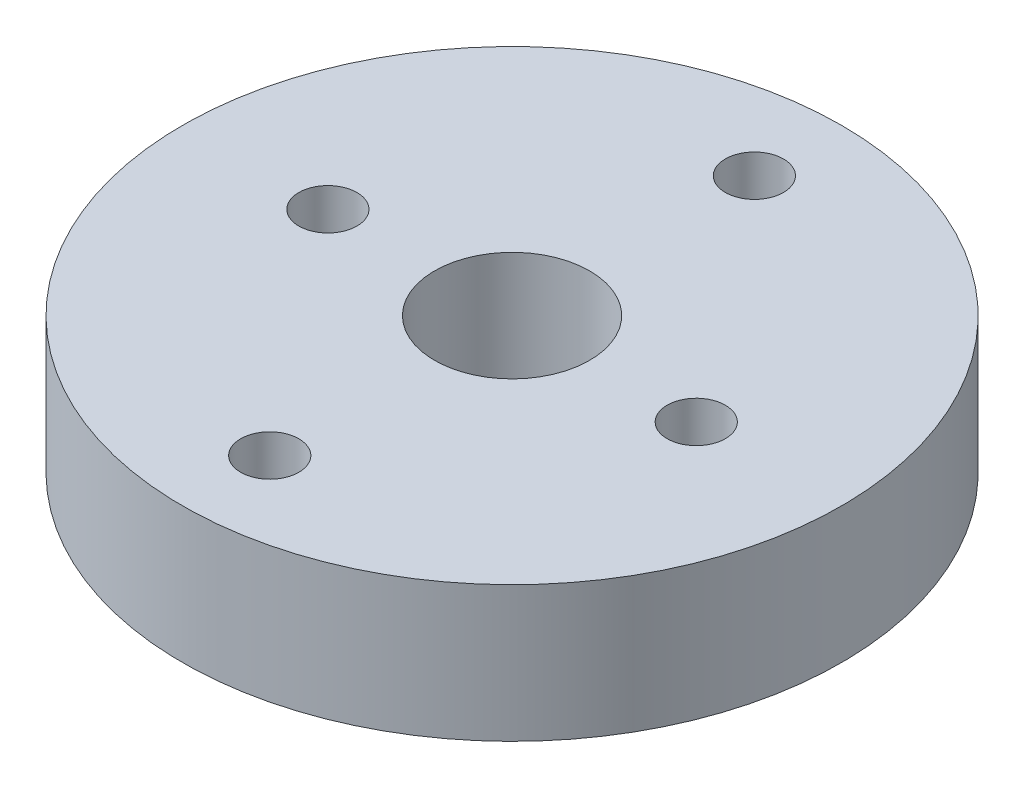
ISO-10303-21;
HEADER;
FILE_DESCRIPTION(('STEP AP214'),'2;1');
FILE_NAME('part.step','',(''),(''),'','','');
FILE_SCHEMA(('AUTOMOTIVE_DESIGN { 1 0 10303 214 1 1 1 1 }'));
ENDSEC;
DATA;
#1=APPLICATION_CONTEXT('core data for automotive mechanical design processes');
#2=APPLICATION_PROTOCOL_DEFINITION('international standard','automotive_design',2000,#1);
#3=PRODUCT_CONTEXT('',#1,'mechanical');
#4=PRODUCT('Part','Part','',(#3));
#5=PRODUCT_RELATED_PRODUCT_CATEGORY('part','',(#4));
#6=PRODUCT_DEFINITION_FORMATION('','',#4);
#7=PRODUCT_DEFINITION_CONTEXT('part definition',#1,'design');
#8=PRODUCT_DEFINITION('design','',#6,#7);
#9=PRODUCT_DEFINITION_SHAPE('','',#8);
#10=(LENGTH_UNIT() NAMED_UNIT(*) SI_UNIT(.MILLI.,.METRE.));
#11=(NAMED_UNIT(*) PLANE_ANGLE_UNIT() SI_UNIT($,.RADIAN.));
#12=(NAMED_UNIT(*) SI_UNIT($,.STERADIAN.) SOLID_ANGLE_UNIT());
#13=UNCERTAINTY_MEASURE_WITH_UNIT(LENGTH_MEASURE(1.E-05),#10,'distance_accuracy_value','');
#14=(GEOMETRIC_REPRESENTATION_CONTEXT(3) GLOBAL_UNCERTAINTY_ASSIGNED_CONTEXT((#13)) GLOBAL_UNIT_ASSIGNED_CONTEXT((#10,
#11,#12)) REPRESENTATION_CONTEXT('',''));
#15=CARTESIAN_POINT('',(0.,0.,0.));
#16=DIRECTION('',(0.,0.,1.));
#17=DIRECTION('',(1.,0.,0.));
#18=AXIS2_PLACEMENT_3D('',#15,#16,#17);
#19=CARTESIAN_POINT('',(0.,0.,0.));
#20=DIRECTION('',(0.,1.,0.));
#21=DIRECTION('',(0.,0.,1.));
#22=AXIS2_PLACEMENT_3D('',#19,#20,#21);
#23=PLANE('',#22);
#24=CARTESIAN_POINT('',(0.,0.,12.5));
#25=DIRECTION('',(0.,-1.,0.));
#26=DIRECTION('',(0.,0.,-1.));
#27=AXIS2_PLACEMENT_3D('',#24,#25,#26);
#28=CIRCLE('',#27,1.5);
#29=CARTESIAN_POINT('',(0.,0.,11.));
#30=VERTEX_POINT('',#29);
#31=EDGE_CURVE('E48',#30,#30,#28,.F.);
#32=ORIENTED_EDGE('',*,*,#31,.T.);
#33=EDGE_LOOP('',(#32));
#34=FACE_BOUND('',#33,.T.);
#35=CARTESIAN_POINT('',(-9.5,0.,0.));
#36=DIRECTION('',(0.,-1.,0.));
#37=DIRECTION('',(0.,0.,-1.));
#38=AXIS2_PLACEMENT_3D('',#35,#36,#37);
#39=CIRCLE('',#38,1.5);
#40=CARTESIAN_POINT('',(-9.5,0.,-1.5));
#41=VERTEX_POINT('',#40);
#42=EDGE_CURVE('E25',#41,#41,#39,.F.);
#43=ORIENTED_EDGE('',*,*,#42,.T.);
#44=EDGE_LOOP('',(#43));
#45=FACE_BOUND('',#44,.T.);
#46=CARTESIAN_POINT('',(9.5,0.,0.));
#47=DIRECTION('',(0.,-1.,0.));
#48=DIRECTION('',(0.,0.,-1.));
#49=AXIS2_PLACEMENT_3D('',#46,#47,#48);
#50=CIRCLE('',#49,1.5);
#51=CARTESIAN_POINT('',(9.5,0.,-1.5));
#52=VERTEX_POINT('',#51);
#53=EDGE_CURVE('E51',#52,#52,#50,.F.);
#54=ORIENTED_EDGE('',*,*,#53,.T.);
#55=EDGE_LOOP('',(#54));
#56=FACE_BOUND('',#55,.T.);
#57=CARTESIAN_POINT('',(0.,0.,-12.5));
#58=DIRECTION('',(0.,-1.,0.));
#59=DIRECTION('',(0.,0.,-1.));
#60=AXIS2_PLACEMENT_3D('',#57,#58,#59);
#61=CIRCLE('',#60,1.5);
#62=CARTESIAN_POINT('',(0.,0.,-14.));
#63=VERTEX_POINT('',#62);
#64=EDGE_CURVE('E59',#63,#63,#61,.F.);
#65=ORIENTED_EDGE('',*,*,#64,.T.);
#66=EDGE_LOOP('',(#65));
#67=FACE_BOUND('',#66,.T.);
#68=CARTESIAN_POINT('',(0.,0.,0.));
#69=DIRECTION('',(0.,-1.,0.));
#70=DIRECTION('',(0.,0.,-1.));
#71=AXIS2_PLACEMENT_3D('',#68,#69,#70);
#72=CIRCLE('',#71,4.);
#73=CARTESIAN_POINT('',(0.,0.,-4.));
#74=VERTEX_POINT('',#73);
#75=EDGE_CURVE('E54',#74,#74,#72,.F.);
#76=ORIENTED_EDGE('',*,*,#75,.T.);
#77=EDGE_LOOP('',(#76));
#78=FACE_BOUND('',#77,.T.);
#79=CARTESIAN_POINT('',(0.,0.,0.));
#80=DIRECTION('',(0.,-1.,0.));
#81=DIRECTION('',(0.,0.,-1.));
#82=AXIS2_PLACEMENT_3D('',#79,#80,#81);
#83=CIRCLE('',#82,17.);
#84=CARTESIAN_POINT('',(0.,0.,-17.));
#85=VERTEX_POINT('',#84);
#86=EDGE_CURVE('E57',#85,#85,#83,.F.);
#87=ORIENTED_EDGE('',*,*,#86,.F.);
#88=EDGE_LOOP('',(#87));
#89=FACE_BOUND('',#88,.T.);
#90=ADVANCED_FACE('F22',(#34,#45,#56,#67,#78,#89),#23,.F.);
#91=CARTESIAN_POINT('',(-9.5,7.,0.));
#92=DIRECTION('',(0.,-1.,0.));
#93=DIRECTION('',(0.,0.,-1.));
#94=AXIS2_PLACEMENT_3D('',#91,#92,#93);
#95=CYLINDRICAL_SURFACE('',#94,1.5);
#96=CARTESIAN_POINT('',(-9.5,7.,0.));
#97=DIRECTION('',(0.,-1.,0.));
#98=DIRECTION('',(0.,0.,-1.));
#99=AXIS2_PLACEMENT_3D('',#96,#97,#98);
#100=CIRCLE('',#99,1.5);
#101=CARTESIAN_POINT('',(-9.5,7.,-1.5));
#102=VERTEX_POINT('',#101);
#103=EDGE_CURVE('E45',#102,#102,#100,.T.);
#104=ORIENTED_EDGE('',*,*,#103,.F.);
#105=EDGE_LOOP('',(#104));
#106=FACE_BOUND('',#105,.T.);
#107=ORIENTED_EDGE('',*,*,#42,.F.);
#108=EDGE_LOOP('',(#107));
#109=FACE_BOUND('',#108,.T.);
#110=ADVANCED_FACE('F68',(#106,#109),#95,.F.);
#111=CARTESIAN_POINT('',(0.,7.,-12.5));
#112=DIRECTION('',(0.,-1.,0.));
#113=DIRECTION('',(0.,0.,-1.));
#114=AXIS2_PLACEMENT_3D('',#111,#112,#113);
#115=CYLINDRICAL_SURFACE('',#114,1.5);
#116=CARTESIAN_POINT('',(0.,7.,-12.5));
#117=DIRECTION('',(0.,-1.,0.));
#118=DIRECTION('',(0.,0.,-1.));
#119=AXIS2_PLACEMENT_3D('',#116,#117,#118);
#120=CIRCLE('',#119,1.5);
#121=CARTESIAN_POINT('',(0.,7.,-14.));
#122=VERTEX_POINT('',#121);
#123=EDGE_CURVE('E42',#122,#122,#120,.T.);
#124=ORIENTED_EDGE('',*,*,#123,.F.);
#125=EDGE_LOOP('',(#124));
#126=FACE_BOUND('',#125,.T.);
#127=ORIENTED_EDGE('',*,*,#64,.F.);
#128=EDGE_LOOP('',(#127));
#129=FACE_BOUND('',#128,.T.);
#130=ADVANCED_FACE('F70',(#126,#129),#115,.F.);
#131=CARTESIAN_POINT('',(0.,7.,0.));
#132=DIRECTION('',(0.,-1.,0.));
#133=DIRECTION('',(0.,0.,-1.));
#134=AXIS2_PLACEMENT_3D('',#131,#132,#133);
#135=CYLINDRICAL_SURFACE('',#134,17.);
#136=ORIENTED_EDGE('',*,*,#86,.T.);
#137=EDGE_LOOP('',(#136));
#138=FACE_BOUND('',#137,.T.);
#139=CARTESIAN_POINT('',(0.,7.,0.));
#140=DIRECTION('',(0.,-1.,0.));
#141=DIRECTION('',(0.,0.,-1.));
#142=AXIS2_PLACEMENT_3D('',#139,#140,#141);
#143=CIRCLE('',#142,17.);
#144=CARTESIAN_POINT('',(0.,7.,-17.));
#145=VERTEX_POINT('',#144);
#146=EDGE_CURVE('E39',#145,#145,#143,.F.);
#147=ORIENTED_EDGE('',*,*,#146,.F.);
#148=EDGE_LOOP('',(#147));
#149=FACE_BOUND('',#148,.T.);
#150=ADVANCED_FACE('F77',(#138,#149),#135,.T.);
#151=CARTESIAN_POINT('',(0.,7.,0.));
#152=DIRECTION('',(0.,-1.,0.));
#153=DIRECTION('',(0.,0.,-1.));
#154=AXIS2_PLACEMENT_3D('',#151,#152,#153);
#155=CYLINDRICAL_SURFACE('',#154,4.);
#156=CARTESIAN_POINT('',(0.,7.,0.));
#157=DIRECTION('',(0.,-1.,0.));
#158=DIRECTION('',(0.,0.,-1.));
#159=AXIS2_PLACEMENT_3D('',#156,#157,#158);
#160=CIRCLE('',#159,4.);
#161=CARTESIAN_POINT('',(0.,7.,-4.));
#162=VERTEX_POINT('',#161);
#163=EDGE_CURVE('E34',#162,#162,#160,.T.);
#164=ORIENTED_EDGE('',*,*,#163,.F.);
#165=EDGE_LOOP('',(#164));
#166=FACE_BOUND('',#165,.T.);
#167=ORIENTED_EDGE('',*,*,#75,.F.);
#168=EDGE_LOOP('',(#167));
#169=FACE_BOUND('',#168,.T.);
#170=ADVANCED_FACE('F96',(#166,#169),#155,.F.);
#171=CARTESIAN_POINT('',(9.5,7.,0.));
#172=DIRECTION('',(0.,-1.,0.));
#173=DIRECTION('',(0.,0.,-1.));
#174=AXIS2_PLACEMENT_3D('',#171,#172,#173);
#175=CYLINDRICAL_SURFACE('',#174,1.5);
#176=CARTESIAN_POINT('',(9.5,7.,0.));
#177=DIRECTION('',(0.,-1.,0.));
#178=DIRECTION('',(0.,0.,-1.));
#179=AXIS2_PLACEMENT_3D('',#176,#177,#178);
#180=CIRCLE('',#179,1.5);
#181=CARTESIAN_POINT('',(9.5,7.,-1.5));
#182=VERTEX_POINT('',#181);
#183=EDGE_CURVE('E29',#182,#182,#180,.T.);
#184=ORIENTED_EDGE('',*,*,#183,.F.);
#185=EDGE_LOOP('',(#184));
#186=FACE_BOUND('',#185,.T.);
#187=ORIENTED_EDGE('',*,*,#53,.F.);
#188=EDGE_LOOP('',(#187));
#189=FACE_BOUND('',#188,.T.);
#190=ADVANCED_FACE('F89',(#186,#189),#175,.F.);
#191=CARTESIAN_POINT('',(0.,7.,12.5));
#192=DIRECTION('',(0.,-1.,0.));
#193=DIRECTION('',(0.,0.,-1.));
#194=AXIS2_PLACEMENT_3D('',#191,#192,#193);
#195=CYLINDRICAL_SURFACE('',#194,1.5);
#196=CARTESIAN_POINT('',(0.,7.,12.5));
#197=DIRECTION('',(0.,-1.,0.));
#198=DIRECTION('',(0.,0.,-1.));
#199=AXIS2_PLACEMENT_3D('',#196,#197,#198);
#200=CIRCLE('',#199,1.5);
#201=CARTESIAN_POINT('',(0.,7.,11.));
#202=VERTEX_POINT('',#201);
#203=EDGE_CURVE('E12',#202,#202,#200,.T.);
#204=ORIENTED_EDGE('',*,*,#203,.F.);
#205=EDGE_LOOP('',(#204));
#206=FACE_BOUND('',#205,.T.);
#207=ORIENTED_EDGE('',*,*,#31,.F.);
#208=EDGE_LOOP('',(#207));
#209=FACE_BOUND('',#208,.T.);
#210=ADVANCED_FACE('F84',(#206,#209),#195,.F.);
#211=CARTESIAN_POINT('',(0.,7.,0.));
#212=DIRECTION('',(0.,1.,0.));
#213=DIRECTION('',(0.,0.,1.));
#214=AXIS2_PLACEMENT_3D('',#211,#212,#213);
#215=PLANE('',#214);
#216=ORIENTED_EDGE('',*,*,#203,.T.);
#217=EDGE_LOOP('',(#216));
#218=FACE_BOUND('',#217,.T.);
#219=ORIENTED_EDGE('',*,*,#183,.T.);
#220=EDGE_LOOP('',(#219));
#221=FACE_BOUND('',#220,.T.);
#222=ORIENTED_EDGE('',*,*,#163,.T.);
#223=EDGE_LOOP('',(#222));
#224=FACE_BOUND('',#223,.T.);
#225=ORIENTED_EDGE('',*,*,#146,.T.);
#226=EDGE_LOOP('',(#225));
#227=FACE_BOUND('',#226,.T.);
#228=ORIENTED_EDGE('',*,*,#123,.T.);
#229=EDGE_LOOP('',(#228));
#230=FACE_BOUND('',#229,.T.);
#231=ORIENTED_EDGE('',*,*,#103,.T.);
#232=EDGE_LOOP('',(#231));
#233=FACE_BOUND('',#232,.T.);
#234=ADVANCED_FACE('F82',(#218,#221,#224,#227,#230,#233),#215,.T.);
#235=CLOSED_SHELL('',(#90,#110,#130,#150,#170,#190,#210,#234));
#236=MANIFOLD_SOLID_BREP('B1',#235);
#237=ADVANCED_BREP_SHAPE_REPRESENTATION('',(#18,#236),#14);
#238=SHAPE_DEFINITION_REPRESENTATION(#9,#237);
ENDSEC;
END-ISO-10303-21;
